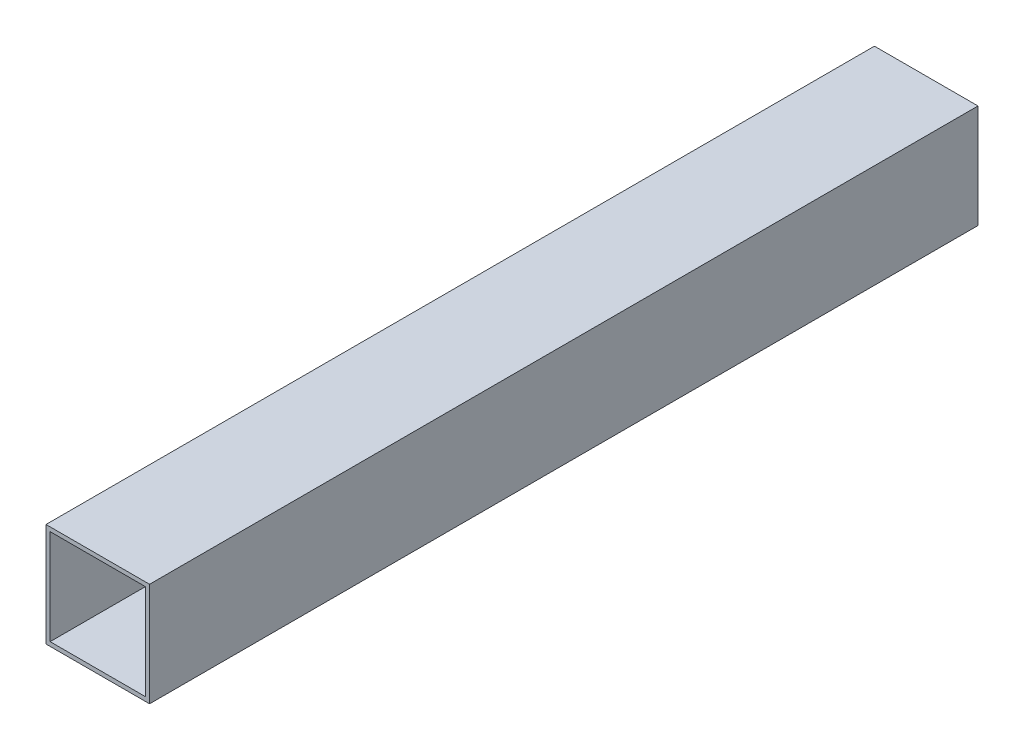
ISO-10303-21;
HEADER;
FILE_DESCRIPTION(('STEP AP214'),'2;1');
FILE_NAME('part.step','',(''),(''),'','','');
FILE_SCHEMA(('AUTOMOTIVE_DESIGN { 1 0 10303 214 1 1 1 1 }'));
ENDSEC;
DATA;
#1=APPLICATION_CONTEXT('core data for automotive mechanical design processes');
#2=APPLICATION_PROTOCOL_DEFINITION('international standard','automotive_design',2000,#1);
#3=PRODUCT_CONTEXT('',#1,'mechanical');
#4=PRODUCT('Part','Part','',(#3));
#5=PRODUCT_RELATED_PRODUCT_CATEGORY('part','',(#4));
#6=PRODUCT_DEFINITION_FORMATION('','',#4);
#7=PRODUCT_DEFINITION_CONTEXT('part definition',#1,'design');
#8=PRODUCT_DEFINITION('design','',#6,#7);
#9=PRODUCT_DEFINITION_SHAPE('','',#8);
#10=(LENGTH_UNIT() NAMED_UNIT(*) SI_UNIT(.MILLI.,.METRE.));
#11=(NAMED_UNIT(*) PLANE_ANGLE_UNIT() SI_UNIT($,.RADIAN.));
#12=(NAMED_UNIT(*) SI_UNIT($,.STERADIAN.) SOLID_ANGLE_UNIT());
#13=UNCERTAINTY_MEASURE_WITH_UNIT(LENGTH_MEASURE(1.E-05),#10,'distance_accuracy_value','');
#14=(GEOMETRIC_REPRESENTATION_CONTEXT(3) GLOBAL_UNCERTAINTY_ASSIGNED_CONTEXT((#13)) GLOBAL_UNIT_ASSIGNED_CONTEXT((#10,
#11,#12)) REPRESENTATION_CONTEXT('',''));
#15=CARTESIAN_POINT('',(0.,0.,0.));
#16=DIRECTION('',(0.,0.,1.));
#17=DIRECTION('',(1.,0.,0.));
#18=AXIS2_PLACEMENT_3D('',#15,#16,#17);
#19=CARTESIAN_POINT('',(0.,0.,400.));
#20=DIRECTION('',(0.,0.,-1.));
#21=DIRECTION('',(-1.,0.,0.));
#22=AXIS2_PLACEMENT_3D('',#19,#20,#21);
#23=PLANE('',#22);
#24=DIRECTION('',(0.,-1.,0.));
#25=VECTOR('',#24,1.);
#26=CARTESIAN_POINT('',(0.,0.,400.));
#27=LINE('',#26,#25);
#28=CARTESIAN_POINT('',(0.,50.,400.));
#29=VERTEX_POINT('',#28);
#30=CARTESIAN_POINT('',(0.,0.,400.));
#31=VERTEX_POINT('',#30);
#32=EDGE_CURVE('E157',#29,#31,#27,.T.);
#33=ORIENTED_EDGE('',*,*,#32,.T.);
#34=DIRECTION('',(1.,0.,0.));
#35=VECTOR('',#34,1.);
#36=CARTESIAN_POINT('',(0.,0.,400.));
#37=LINE('',#36,#35);
#38=CARTESIAN_POINT('',(50.,0.,400.));
#39=VERTEX_POINT('',#38);
#40=EDGE_CURVE('E161',#31,#39,#37,.T.);
#41=ORIENTED_EDGE('',*,*,#40,.T.);
#42=DIRECTION('',(0.,1.,0.));
#43=VECTOR('',#42,1.);
#44=CARTESIAN_POINT('',(50.,0.,400.));
#45=LINE('',#44,#43);
#46=CARTESIAN_POINT('',(50.,50.,400.));
#47=VERTEX_POINT('',#46);
#48=EDGE_CURVE('E165',#39,#47,#45,.T.);
#49=ORIENTED_EDGE('',*,*,#48,.T.);
#50=DIRECTION('',(-1.,0.,0.));
#51=VECTOR('',#50,1.);
#52=CARTESIAN_POINT('',(0.,50.,400.));
#53=LINE('',#52,#51);
#54=EDGE_CURVE('E168',#47,#29,#53,.T.);
#55=ORIENTED_EDGE('',*,*,#54,.T.);
#56=EDGE_LOOP('',(#33,#41,#49,#55));
#57=FACE_BOUND('',#56,.T.);
#58=DIRECTION('',(1.,0.,0.));
#59=VECTOR('',#58,1.);
#60=CARTESIAN_POINT('',(2.,2.,400.));
#61=LINE('',#60,#59);
#62=CARTESIAN_POINT('',(2.,2.,400.));
#63=VERTEX_POINT('',#62);
#64=CARTESIAN_POINT('',(48.,2.,400.));
#65=VERTEX_POINT('',#64);
#66=EDGE_CURVE('E109',#63,#65,#61,.T.);
#67=ORIENTED_EDGE('',*,*,#66,.F.);
#68=DIRECTION('',(0.,-1.,0.));
#69=VECTOR('',#68,1.);
#70=CARTESIAN_POINT('',(2.,2.,400.));
#71=LINE('',#70,#69);
#72=CARTESIAN_POINT('',(2.,48.,400.));
#73=VERTEX_POINT('',#72);
#74=EDGE_CURVE('E135',#73,#63,#71,.T.);
#75=ORIENTED_EDGE('',*,*,#74,.F.);
#76=DIRECTION('',(-1.,0.,0.));
#77=VECTOR('',#76,1.);
#78=CARTESIAN_POINT('',(2.,48.,400.));
#79=LINE('',#78,#77);
#80=CARTESIAN_POINT('',(48.,48.,400.));
#81=VERTEX_POINT('',#80);
#82=EDGE_CURVE('E131',#81,#73,#79,.T.);
#83=ORIENTED_EDGE('',*,*,#82,.F.);
#84=DIRECTION('',(0.,1.,0.));
#85=VECTOR('',#84,1.);
#86=CARTESIAN_POINT('',(48.,2.,400.));
#87=LINE('',#86,#85);
#88=EDGE_CURVE('E118',#65,#81,#87,.T.);
#89=ORIENTED_EDGE('',*,*,#88,.F.);
#90=EDGE_LOOP('',(#67,#75,#83,#89));
#91=FACE_BOUND('',#90,.T.);
#92=ADVANCED_FACE('F43',(#57,#91),#23,.F.);
#93=CARTESIAN_POINT('',(0.,0.,0.));
#94=DIRECTION('',(0.,0.,-1.));
#95=DIRECTION('',(-1.,0.,0.));
#96=AXIS2_PLACEMENT_3D('',#93,#94,#95);
#97=PLANE('',#96);
#98=DIRECTION('',(0.,-1.,0.));
#99=VECTOR('',#98,1.);
#100=CARTESIAN_POINT('',(0.,0.,0.));
#101=LINE('',#100,#99);
#102=CARTESIAN_POINT('',(0.,50.,0.));
#103=VERTEX_POINT('',#102);
#104=CARTESIAN_POINT('',(0.,0.,0.));
#105=VERTEX_POINT('',#104);
#106=EDGE_CURVE('E127',#103,#105,#101,.T.);
#107=ORIENTED_EDGE('',*,*,#106,.F.);
#108=DIRECTION('',(-1.,0.,0.));
#109=VECTOR('',#108,1.);
#110=CARTESIAN_POINT('',(0.,50.,0.));
#111=LINE('',#110,#109);
#112=CARTESIAN_POINT('',(50.,50.,0.));
#113=VERTEX_POINT('',#112);
#114=EDGE_CURVE('E162',#113,#103,#111,.T.);
#115=ORIENTED_EDGE('',*,*,#114,.F.);
#116=DIRECTION('',(0.,1.,0.));
#117=VECTOR('',#116,1.);
#118=CARTESIAN_POINT('',(50.,0.,0.));
#119=LINE('',#118,#117);
#120=CARTESIAN_POINT('',(50.,0.,0.));
#121=VERTEX_POINT('',#120);
#122=EDGE_CURVE('E178',#121,#113,#119,.T.);
#123=ORIENTED_EDGE('',*,*,#122,.F.);
#124=DIRECTION('',(1.,0.,0.));
#125=VECTOR('',#124,1.);
#126=CARTESIAN_POINT('',(0.,0.,0.));
#127=LINE('',#126,#125);
#128=EDGE_CURVE('E175',#105,#121,#127,.T.);
#129=ORIENTED_EDGE('',*,*,#128,.F.);
#130=EDGE_LOOP('',(#107,#115,#123,#129));
#131=FACE_BOUND('',#130,.T.);
#132=DIRECTION('',(0.,-1.,0.));
#133=VECTOR('',#132,1.);
#134=CARTESIAN_POINT('',(2.,2.,0.));
#135=LINE('',#134,#133);
#136=CARTESIAN_POINT('',(2.,48.,0.));
#137=VERTEX_POINT('',#136);
#138=CARTESIAN_POINT('',(2.,2.,0.));
#139=VERTEX_POINT('',#138);
#140=EDGE_CURVE('E119',#137,#139,#135,.T.);
#141=ORIENTED_EDGE('',*,*,#140,.T.);
#142=DIRECTION('',(1.,0.,0.));
#143=VECTOR('',#142,1.);
#144=CARTESIAN_POINT('',(2.,2.,0.));
#145=LINE('',#144,#143);
#146=CARTESIAN_POINT('',(48.,2.,0.));
#147=VERTEX_POINT('',#146);
#148=EDGE_CURVE('E67',#139,#147,#145,.T.);
#149=ORIENTED_EDGE('',*,*,#148,.T.);
#150=DIRECTION('',(0.,1.,0.));
#151=VECTOR('',#150,1.);
#152=CARTESIAN_POINT('',(48.,2.,0.));
#153=LINE('',#152,#151);
#154=CARTESIAN_POINT('',(48.,48.,0.));
#155=VERTEX_POINT('',#154);
#156=EDGE_CURVE('E125',#147,#155,#153,.T.);
#157=ORIENTED_EDGE('',*,*,#156,.T.);
#158=DIRECTION('',(-1.,0.,0.));
#159=VECTOR('',#158,1.);
#160=CARTESIAN_POINT('',(2.,48.,0.));
#161=LINE('',#160,#159);
#162=EDGE_CURVE('E144',#155,#137,#161,.T.);
#163=ORIENTED_EDGE('',*,*,#162,.T.);
#164=EDGE_LOOP('',(#141,#149,#157,#163));
#165=FACE_BOUND('',#164,.T.);
#166=ADVANCED_FACE('F201',(#131,#165),#97,.T.);
#167=CARTESIAN_POINT('',(0.,0.,400.));
#168=DIRECTION('',(1.,0.,0.));
#169=DIRECTION('',(0.,1.,0.));
#170=AXIS2_PLACEMENT_3D('',#167,#168,#169);
#171=PLANE('',#170);
#172=ORIENTED_EDGE('',*,*,#106,.T.);
#173=DIRECTION('',(0.,0.,-1.));
#174=VECTOR('',#173,1.);
#175=CARTESIAN_POINT('',(0.,0.,400.));
#176=LINE('',#175,#174);
#177=EDGE_CURVE('E11',#31,#105,#176,.T.);
#178=ORIENTED_EDGE('',*,*,#177,.F.);
#179=ORIENTED_EDGE('',*,*,#32,.F.);
#180=DIRECTION('',(0.,0.,-1.));
#181=VECTOR('',#180,1.);
#182=CARTESIAN_POINT('',(0.,50.,400.));
#183=LINE('',#182,#181);
#184=EDGE_CURVE('E171',#29,#103,#183,.T.);
#185=ORIENTED_EDGE('',*,*,#184,.T.);
#186=EDGE_LOOP('',(#172,#178,#179,#185));
#187=FACE_BOUND('',#186,.T.);
#188=ADVANCED_FACE('F45',(#187),#171,.F.);
#189=CARTESIAN_POINT('',(0.,0.,400.));
#190=DIRECTION('',(0.,1.,0.));
#191=DIRECTION('',(0.,0.,1.));
#192=AXIS2_PLACEMENT_3D('',#189,#190,#191);
#193=PLANE('',#192);
#194=ORIENTED_EDGE('',*,*,#128,.T.);
#195=DIRECTION('',(0.,0.,-1.));
#196=VECTOR('',#195,1.);
#197=CARTESIAN_POINT('',(50.,0.,400.));
#198=LINE('',#197,#196);
#199=EDGE_CURVE('E52',#39,#121,#198,.T.);
#200=ORIENTED_EDGE('',*,*,#199,.F.);
#201=ORIENTED_EDGE('',*,*,#40,.F.);
#202=ORIENTED_EDGE('',*,*,#177,.T.);
#203=EDGE_LOOP('',(#194,#200,#201,#202));
#204=FACE_BOUND('',#203,.T.);
#205=ADVANCED_FACE('F211',(#204),#193,.F.);
#206=CARTESIAN_POINT('',(50.,0.,400.));
#207=DIRECTION('',(-1.,0.,0.));
#208=DIRECTION('',(0.,-1.,0.));
#209=AXIS2_PLACEMENT_3D('',#206,#207,#208);
#210=PLANE('',#209);
#211=ORIENTED_EDGE('',*,*,#122,.T.);
#212=DIRECTION('',(0.,0.,-1.));
#213=VECTOR('',#212,1.);
#214=CARTESIAN_POINT('',(50.,50.,400.));
#215=LINE('',#214,#213);
#216=EDGE_CURVE('E186',#47,#113,#215,.T.);
#217=ORIENTED_EDGE('',*,*,#216,.F.);
#218=ORIENTED_EDGE('',*,*,#48,.F.);
#219=ORIENTED_EDGE('',*,*,#199,.T.);
#220=EDGE_LOOP('',(#211,#217,#218,#219));
#221=FACE_BOUND('',#220,.T.);
#222=ADVANCED_FACE('F195',(#221),#210,.F.);
#223=CARTESIAN_POINT('',(0.,50.,400.));
#224=DIRECTION('',(0.,-1.,0.));
#225=DIRECTION('',(0.,0.,-1.));
#226=AXIS2_PLACEMENT_3D('',#223,#224,#225);
#227=PLANE('',#226);
#228=ORIENTED_EDGE('',*,*,#114,.T.);
#229=ORIENTED_EDGE('',*,*,#184,.F.);
#230=ORIENTED_EDGE('',*,*,#54,.F.);
#231=ORIENTED_EDGE('',*,*,#216,.T.);
#232=EDGE_LOOP('',(#228,#229,#230,#231));
#233=FACE_BOUND('',#232,.T.);
#234=ADVANCED_FACE('F205',(#233),#227,.F.);
#235=CARTESIAN_POINT('',(2.,2.,400.));
#236=DIRECTION('',(0.,1.,0.));
#237=DIRECTION('',(0.,0.,1.));
#238=AXIS2_PLACEMENT_3D('',#235,#236,#237);
#239=PLANE('',#238);
#240=ORIENTED_EDGE('',*,*,#148,.F.);
#241=DIRECTION('',(0.,0.,-1.));
#242=VECTOR('',#241,1.);
#243=CARTESIAN_POINT('',(2.,2.,400.));
#244=LINE('',#243,#242);
#245=EDGE_CURVE('E113',#63,#139,#244,.T.);
#246=ORIENTED_EDGE('',*,*,#245,.F.);
#247=ORIENTED_EDGE('',*,*,#66,.T.);
#248=DIRECTION('',(0.,0.,-1.));
#249=VECTOR('',#248,1.);
#250=CARTESIAN_POINT('',(48.,2.,400.));
#251=LINE('',#250,#249);
#252=EDGE_CURVE('E112',#65,#147,#251,.T.);
#253=ORIENTED_EDGE('',*,*,#252,.T.);
#254=EDGE_LOOP('',(#240,#246,#247,#253));
#255=FACE_BOUND('',#254,.T.);
#256=ADVANCED_FACE('F111',(#255),#239,.T.);
#257=CARTESIAN_POINT('',(48.,2.,400.));
#258=DIRECTION('',(-1.,0.,0.));
#259=DIRECTION('',(0.,-1.,0.));
#260=AXIS2_PLACEMENT_3D('',#257,#258,#259);
#261=PLANE('',#260);
#262=ORIENTED_EDGE('',*,*,#156,.F.);
#263=ORIENTED_EDGE('',*,*,#252,.F.);
#264=ORIENTED_EDGE('',*,*,#88,.T.);
#265=DIRECTION('',(0.,0.,-1.));
#266=VECTOR('',#265,1.);
#267=CARTESIAN_POINT('',(48.,48.,400.));
#268=LINE('',#267,#266);
#269=EDGE_CURVE('E128',#81,#155,#268,.T.);
#270=ORIENTED_EDGE('',*,*,#269,.T.);
#271=EDGE_LOOP('',(#262,#263,#264,#270));
#272=FACE_BOUND('',#271,.T.);
#273=ADVANCED_FACE('F122',(#272),#261,.T.);
#274=CARTESIAN_POINT('',(2.,48.,400.));
#275=DIRECTION('',(0.,-1.,0.));
#276=DIRECTION('',(0.,0.,-1.));
#277=AXIS2_PLACEMENT_3D('',#274,#275,#276);
#278=PLANE('',#277);
#279=ORIENTED_EDGE('',*,*,#162,.F.);
#280=ORIENTED_EDGE('',*,*,#269,.F.);
#281=ORIENTED_EDGE('',*,*,#82,.T.);
#282=DIRECTION('',(0.,0.,-1.));
#283=VECTOR('',#282,1.);
#284=CARTESIAN_POINT('',(2.,48.,400.));
#285=LINE('',#284,#283);
#286=EDGE_CURVE('E59',#73,#137,#285,.T.);
#287=ORIENTED_EDGE('',*,*,#286,.T.);
#288=EDGE_LOOP('',(#279,#280,#281,#287));
#289=FACE_BOUND('',#288,.T.);
#290=ADVANCED_FACE('F234',(#289),#278,.T.);
#291=CARTESIAN_POINT('',(2.,2.,400.));
#292=DIRECTION('',(1.,0.,0.));
#293=DIRECTION('',(0.,0.,-1.));
#294=AXIS2_PLACEMENT_3D('',#291,#292,#293);
#295=PLANE('',#294);
#296=ORIENTED_EDGE('',*,*,#140,.F.);
#297=ORIENTED_EDGE('',*,*,#286,.F.);
#298=ORIENTED_EDGE('',*,*,#74,.T.);
#299=ORIENTED_EDGE('',*,*,#245,.T.);
#300=EDGE_LOOP('',(#296,#297,#298,#299));
#301=FACE_BOUND('',#300,.T.);
#302=ADVANCED_FACE('F238',(#301),#295,.T.);
#303=CLOSED_SHELL('',(#92,#166,#188,#205,#222,#234,#256,#273,#290,#302));
#304=MANIFOLD_SOLID_BREP('B2',#303);
#305=ADVANCED_BREP_SHAPE_REPRESENTATION('',(#18,#304),#14);
#306=SHAPE_DEFINITION_REPRESENTATION(#9,#305);
ENDSEC;
END-ISO-10303-21;
